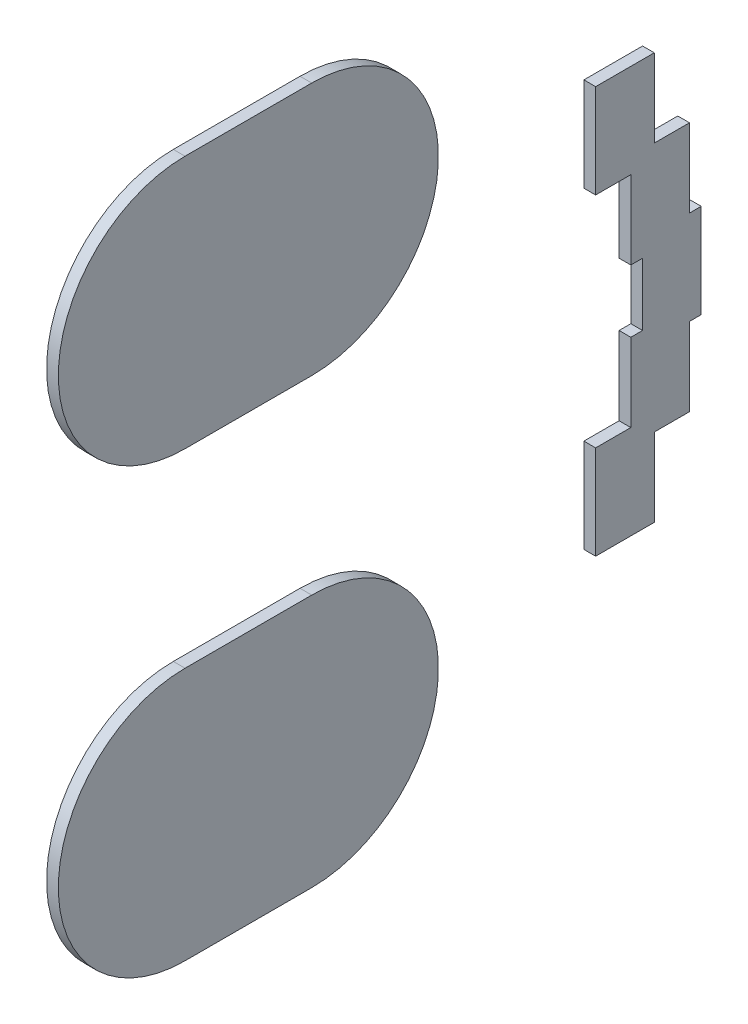
ISO-10303-21;
HEADER;
FILE_DESCRIPTION(('STEP AP214'),'2;1');
FILE_NAME('part.step','',(''),(''),'','','');
FILE_SCHEMA(('AUTOMOTIVE_DESIGN { 1 0 10303 214 1 1 1 1 }'));
ENDSEC;
DATA;
#1=APPLICATION_CONTEXT('core data for automotive mechanical design processes');
#2=APPLICATION_PROTOCOL_DEFINITION('international standard','automotive_design',2000,#1);
#3=PRODUCT_CONTEXT('',#1,'mechanical');
#4=PRODUCT('Part','Part','',(#3));
#5=PRODUCT_RELATED_PRODUCT_CATEGORY('part','',(#4));
#6=PRODUCT_DEFINITION_FORMATION('','',#4);
#7=PRODUCT_DEFINITION_CONTEXT('part definition',#1,'design');
#8=PRODUCT_DEFINITION('design','',#6,#7);
#9=PRODUCT_DEFINITION_SHAPE('','',#8);
#10=(LENGTH_UNIT() NAMED_UNIT(*) SI_UNIT(.MILLI.,.METRE.));
#11=(NAMED_UNIT(*) PLANE_ANGLE_UNIT() SI_UNIT($,.RADIAN.));
#12=(NAMED_UNIT(*) SI_UNIT($,.STERADIAN.) SOLID_ANGLE_UNIT());
#13=UNCERTAINTY_MEASURE_WITH_UNIT(LENGTH_MEASURE(1.E-05),#10,'distance_accuracy_value','');
#14=(GEOMETRIC_REPRESENTATION_CONTEXT(3) GLOBAL_UNCERTAINTY_ASSIGNED_CONTEXT((#13)) GLOBAL_UNIT_ASSIGNED_CONTEXT((#10,
#11,#12)) REPRESENTATION_CONTEXT('',''));
#15=CARTESIAN_POINT('',(0.,0.,0.));
#16=DIRECTION('',(0.,0.,1.));
#17=DIRECTION('',(1.,0.,0.));
#18=AXIS2_PLACEMENT_3D('',#15,#16,#17);
#19=CARTESIAN_POINT('',(29.8,3.2,22.65));
#20=DIRECTION('',(0.,-1.,0.));
#21=DIRECTION('',(0.,0.,-1.));
#22=AXIS2_PLACEMENT_3D('',#19,#20,#21);
#23=PLANE('',#22);
#24=DIRECTION('',(-1.,0.,0.));
#25=VECTOR('',#24,1.);
#26=CARTESIAN_POINT('',(29.8,3.2,22.05));
#27=LINE('',#26,#25);
#28=CARTESIAN_POINT('',(29.8,3.2,22.05));
#29=VERTEX_POINT('',#28);
#30=CARTESIAN_POINT('',(29.5,3.2,22.05));
#31=VERTEX_POINT('',#30);
#32=EDGE_CURVE('E12',#29,#31,#27,.T.);
#33=ORIENTED_EDGE('',*,*,#32,.F.);
#34=DIRECTION('',(0.,0.,-1.));
#35=VECTOR('',#34,1.);
#36=CARTESIAN_POINT('',(29.8,3.2,22.65));
#37=LINE('',#36,#35);
#38=CARTESIAN_POINT('',(29.8,3.2,21.15));
#39=VERTEX_POINT('',#38);
#40=EDGE_CURVE('E228',#29,#39,#37,.T.);
#41=ORIENTED_EDGE('',*,*,#40,.T.);
#42=DIRECTION('',(-1.,0.,0.));
#43=VECTOR('',#42,1.);
#44=CARTESIAN_POINT('',(29.8,3.2,21.15));
#45=LINE('',#44,#43);
#46=CARTESIAN_POINT('',(29.5,3.2,21.15));
#47=VERTEX_POINT('',#46);
#48=EDGE_CURVE('E220',#39,#47,#45,.T.);
#49=ORIENTED_EDGE('',*,*,#48,.T.);
#50=DIRECTION('',(0.,0.,-1.));
#51=VECTOR('',#50,1.);
#52=CARTESIAN_POINT('',(29.5,3.2,22.65));
#53=LINE('',#52,#51);
#54=EDGE_CURVE('E222',#31,#47,#53,.T.);
#55=ORIENTED_EDGE('',*,*,#54,.F.);
#56=EDGE_LOOP('',(#33,#41,#49,#55));
#57=FACE_BOUND('',#56,.T.);
#58=ADVANCED_FACE('F49',(#57),#23,.F.);
#59=CARTESIAN_POINT('',(0.,0.,22.65));
#60=DIRECTION('',(0.,0.,1.));
#61=DIRECTION('',(1.,0.,0.));
#62=AXIS2_PLACEMENT_3D('',#59,#60,#61);
#63=PLANE('',#62);
#64=DIRECTION('',(0.,1.,0.));
#65=VECTOR('',#64,1.);
#66=CARTESIAN_POINT('',(29.8,0.8,22.65));
#67=LINE('',#66,#65);
#68=CARTESIAN_POINT('',(29.8,0.8,22.65));
#69=VERTEX_POINT('',#68);
#70=CARTESIAN_POINT('',(29.8,2.8,22.65));
#71=VERTEX_POINT('',#70);
#72=EDGE_CURVE('E218',#69,#71,#67,.T.);
#73=ORIENTED_EDGE('',*,*,#72,.T.);
#74=DIRECTION('',(-1.,0.,0.));
#75=VECTOR('',#74,1.);
#76=CARTESIAN_POINT('',(0.,2.8,22.65));
#77=LINE('',#76,#75);
#78=CARTESIAN_POINT('',(29.5,2.8,22.65));
#79=VERTEX_POINT('',#78);
#80=EDGE_CURVE('E59',#71,#79,#77,.T.);
#81=ORIENTED_EDGE('',*,*,#80,.T.);
#82=DIRECTION('',(0.,-1.,0.));
#83=VECTOR('',#82,1.);
#84=CARTESIAN_POINT('',(29.5,3.2,22.65));
#85=LINE('',#84,#83);
#86=CARTESIAN_POINT('',(29.5,0.8,22.65));
#87=VERTEX_POINT('',#86);
#88=EDGE_CURVE('E202',#79,#87,#85,.T.);
#89=ORIENTED_EDGE('',*,*,#88,.T.);
#90=DIRECTION('',(1.,0.,0.));
#91=VECTOR('',#90,1.);
#92=CARTESIAN_POINT('',(29.5,0.8,22.65));
#93=LINE('',#92,#91);
#94=EDGE_CURVE('E216',#87,#69,#93,.T.);
#95=ORIENTED_EDGE('',*,*,#94,.T.);
#96=EDGE_LOOP('',(#73,#81,#89,#95));
#97=FACE_BOUND('',#96,.T.);
#98=ADVANCED_FACE('F330',(#97),#63,.T.);
#99=CARTESIAN_POINT('',(0.,0.,22.35));
#100=DIRECTION('',(0.,0.,1.));
#101=DIRECTION('',(1.,0.,0.));
#102=AXIS2_PLACEMENT_3D('',#99,#100,#101);
#103=PLANE('',#102);
#104=DIRECTION('',(0.,1.,0.));
#105=VECTOR('',#104,1.);
#106=CARTESIAN_POINT('',(29.8,-1.2,22.35));
#107=LINE('',#106,#105);
#108=CARTESIAN_POINT('',(29.8,-0.8,22.35));
#109=VERTEX_POINT('',#108);
#110=CARTESIAN_POINT('',(29.8,0.8,22.35));
#111=VERTEX_POINT('',#110);
#112=EDGE_CURVE('E239',#109,#111,#107,.T.);
#113=ORIENTED_EDGE('',*,*,#112,.T.);
#114=DIRECTION('',(-1.,0.,0.));
#115=VECTOR('',#114,1.);
#116=CARTESIAN_POINT('',(0.,0.8,22.35));
#117=LINE('',#116,#115);
#118=CARTESIAN_POINT('',(29.5,0.8,22.35));
#119=VERTEX_POINT('',#118);
#120=EDGE_CURVE('E71',#111,#119,#117,.T.);
#121=ORIENTED_EDGE('',*,*,#120,.T.);
#122=DIRECTION('',(0.,-1.,0.));
#123=VECTOR('',#122,1.);
#124=CARTESIAN_POINT('',(29.5,1.2,22.35));
#125=LINE('',#124,#123);
#126=CARTESIAN_POINT('',(29.5,-0.8,22.35));
#127=VERTEX_POINT('',#126);
#128=EDGE_CURVE('E240',#119,#127,#125,.T.);
#129=ORIENTED_EDGE('',*,*,#128,.T.);
#130=DIRECTION('',(-1.,0.,0.));
#131=VECTOR('',#130,1.);
#132=CARTESIAN_POINT('',(29.8,-0.8,22.35));
#133=LINE('',#132,#131);
#134=EDGE_CURVE('E319',#109,#127,#133,.T.);
#135=ORIENTED_EDGE('',*,*,#134,.F.);
#136=EDGE_LOOP('',(#113,#121,#129,#135));
#137=FACE_BOUND('',#136,.T.);
#138=ADVANCED_FACE('F415',(#137),#103,.T.);
#139=CARTESIAN_POINT('',(29.8,1.2,22.35));
#140=DIRECTION('',(0.,-1.,0.));
#141=DIRECTION('',(0.,0.,-1.));
#142=AXIS2_PLACEMENT_3D('',#139,#140,#141);
#143=PLANE('',#142);
#144=DIRECTION('',(-1.,0.,0.));
#145=VECTOR('',#144,1.);
#146=CARTESIAN_POINT('',(29.8,1.2,21.15));
#147=LINE('',#146,#145);
#148=CARTESIAN_POINT('',(29.8,1.2,21.15));
#149=VERTEX_POINT('',#148);
#150=CARTESIAN_POINT('',(29.5,1.2,21.15));
#151=VERTEX_POINT('',#150);
#152=EDGE_CURVE('E323',#149,#151,#147,.T.);
#153=ORIENTED_EDGE('',*,*,#152,.F.);
#154=DIRECTION('',(0.,0.,-1.));
#155=VECTOR('',#154,1.);
#156=CARTESIAN_POINT('',(29.8,1.2,22.35));
#157=LINE('',#156,#155);
#158=CARTESIAN_POINT('',(29.8,1.2,20.85));
#159=VERTEX_POINT('',#158);
#160=EDGE_CURVE('E255',#149,#159,#157,.T.);
#161=ORIENTED_EDGE('',*,*,#160,.T.);
#162=DIRECTION('',(-1.,0.,0.));
#163=VECTOR('',#162,1.);
#164=CARTESIAN_POINT('',(29.8,1.2,20.85));
#165=LINE('',#164,#163);
#166=CARTESIAN_POINT('',(29.5,1.2,20.85));
#167=VERTEX_POINT('',#166);
#168=EDGE_CURVE('E238',#159,#167,#165,.T.);
#169=ORIENTED_EDGE('',*,*,#168,.T.);
#170=DIRECTION('',(0.,0.,-1.));
#171=VECTOR('',#170,1.);
#172=CARTESIAN_POINT('',(29.5,1.2,22.35));
#173=LINE('',#172,#171);
#174=EDGE_CURVE('E245',#151,#167,#173,.T.);
#175=ORIENTED_EDGE('',*,*,#174,.F.);
#176=EDGE_LOOP('',(#153,#161,#169,#175));
#177=FACE_BOUND('',#176,.T.);
#178=ADVANCED_FACE('F361',(#177),#143,.F.);
#179=CARTESIAN_POINT('',(0.,0.,21.15));
#180=DIRECTION('',(0.,0.,1.));
#181=DIRECTION('',(1.,0.,0.));
#182=AXIS2_PLACEMENT_3D('',#179,#180,#181);
#183=PLANE('',#182);
#184=DIRECTION('',(-1.,0.,0.));
#185=VECTOR('',#184,1.);
#186=CARTESIAN_POINT('',(0.,-1.2,21.15));
#187=LINE('',#186,#185);
#188=CARTESIAN_POINT('',(29.8,-1.2,21.15));
#189=VERTEX_POINT('',#188);
#190=CARTESIAN_POINT('',(29.5,-1.2,21.15));
#191=VERTEX_POINT('',#190);
#192=EDGE_CURVE('E320',#189,#191,#187,.T.);
#193=ORIENTED_EDGE('',*,*,#192,.F.);
#194=DIRECTION('',(0.,1.,0.));
#195=VECTOR('',#194,1.);
#196=CARTESIAN_POINT('',(29.8,-3.2,21.15));
#197=LINE('',#196,#195);
#198=CARTESIAN_POINT('',(29.8,-3.2,21.15));
#199=VERTEX_POINT('',#198);
#200=EDGE_CURVE('E264',#199,#189,#197,.T.);
#201=ORIENTED_EDGE('',*,*,#200,.F.);
#202=DIRECTION('',(1.,0.,0.));
#203=VECTOR('',#202,1.);
#204=CARTESIAN_POINT('',(29.5,-3.2,21.15));
#205=LINE('',#204,#203);
#206=CARTESIAN_POINT('',(29.5,-3.2,21.15));
#207=VERTEX_POINT('',#206);
#208=EDGE_CURVE('E271',#207,#199,#205,.T.);
#209=ORIENTED_EDGE('',*,*,#208,.F.);
#210=DIRECTION('',(0.,-1.,0.));
#211=VECTOR('',#210,1.);
#212=CARTESIAN_POINT('',(29.5,-0.8,21.15));
#213=LINE('',#212,#211);
#214=EDGE_CURVE('E257',#191,#207,#213,.T.);
#215=ORIENTED_EDGE('',*,*,#214,.F.);
#216=EDGE_LOOP('',(#193,#201,#209,#215));
#217=FACE_BOUND('',#216,.T.);
#218=ADVANCED_FACE('F377',(#217),#183,.F.);
#219=CARTESIAN_POINT('',(0.,0.,22.05));
#220=DIRECTION('',(0.,0.,1.));
#221=DIRECTION('',(1.,0.,0.));
#222=AXIS2_PLACEMENT_3D('',#219,#220,#221);
#223=PLANE('',#222);
#224=DIRECTION('',(-1.,0.,0.));
#225=VECTOR('',#224,1.);
#226=CARTESIAN_POINT('',(0.,-3.2,22.05));
#227=LINE('',#226,#225);
#228=CARTESIAN_POINT('',(29.8,-3.2,22.05));
#229=VERTEX_POINT('',#228);
#230=CARTESIAN_POINT('',(29.5,-3.2,22.05));
#231=VERTEX_POINT('',#230);
#232=EDGE_CURVE('E315',#229,#231,#227,.T.);
#233=ORIENTED_EDGE('',*,*,#232,.F.);
#234=DIRECTION('',(0.,1.,0.));
#235=VECTOR('',#234,1.);
#236=CARTESIAN_POINT('',(29.8,-5.2,22.05));
#237=LINE('',#236,#235);
#238=CARTESIAN_POINT('',(29.8,-5.2,22.05));
#239=VERTEX_POINT('',#238);
#240=EDGE_CURVE('E287',#239,#229,#237,.T.);
#241=ORIENTED_EDGE('',*,*,#240,.F.);
#242=DIRECTION('',(1.,0.,0.));
#243=VECTOR('',#242,1.);
#244=CARTESIAN_POINT('',(29.5,-5.2,22.05));
#245=LINE('',#244,#243);
#246=CARTESIAN_POINT('',(29.5,-5.2,22.05));
#247=VERTEX_POINT('',#246);
#248=EDGE_CURVE('E298',#247,#239,#245,.T.);
#249=ORIENTED_EDGE('',*,*,#248,.F.);
#250=DIRECTION('',(0.,-1.,0.));
#251=VECTOR('',#250,1.);
#252=CARTESIAN_POINT('',(29.5,-2.8,22.05));
#253=LINE('',#252,#251);
#254=EDGE_CURVE('E281',#231,#247,#253,.T.);
#255=ORIENTED_EDGE('',*,*,#254,.F.);
#256=EDGE_LOOP('',(#233,#241,#249,#255));
#257=FACE_BOUND('',#256,.T.);
#258=ADVANCED_FACE('F384',(#257),#223,.F.);
#259=CARTESIAN_POINT('',(29.5,-2.8,23.55));
#260=DIRECTION('',(1.,0.,0.));
#261=DIRECTION('',(0.,0.,-1.));
#262=AXIS2_PLACEMENT_3D('',#259,#260,#261);
#263=PLANE('',#262);
#264=ORIENTED_EDGE('',*,*,#88,.F.);
#265=DIRECTION('',(0.,0.,-1.));
#266=VECTOR('',#265,1.);
#267=CARTESIAN_POINT('',(29.5,2.8,23.55));
#268=LINE('',#267,#266);
#269=CARTESIAN_POINT('',(29.5,2.8,23.55));
#270=VERTEX_POINT('',#269);
#271=EDGE_CURVE('E61',#270,#79,#268,.T.);
#272=ORIENTED_EDGE('',*,*,#271,.F.);
#273=DIRECTION('',(0.,-1.,0.));
#274=VECTOR('',#273,1.);
#275=CARTESIAN_POINT('',(29.5,5.2,23.55));
#276=LINE('',#275,#274);
#277=CARTESIAN_POINT('',(29.5,5.2,23.55));
#278=VERTEX_POINT('',#277);
#279=EDGE_CURVE('E195',#278,#270,#276,.T.);
#280=ORIENTED_EDGE('',*,*,#279,.F.);
#281=DIRECTION('',(0.,0.,-1.));
#282=VECTOR('',#281,1.);
#283=CARTESIAN_POINT('',(29.5,5.2,23.55));
#284=LINE('',#283,#282);
#285=CARTESIAN_POINT('',(29.5,5.2,22.05));
#286=VERTEX_POINT('',#285);
#287=EDGE_CURVE('E337',#278,#286,#284,.T.);
#288=ORIENTED_EDGE('',*,*,#287,.T.);
#289=DIRECTION('',(0.,-1.,0.));
#290=VECTOR('',#289,1.);
#291=CARTESIAN_POINT('',(29.5,5.2,22.05));
#292=LINE('',#291,#290);
#293=EDGE_CURVE('E339',#286,#31,#292,.T.);
#294=ORIENTED_EDGE('',*,*,#293,.T.);
#295=ORIENTED_EDGE('',*,*,#54,.T.);
#296=DIRECTION('',(0.,-1.,0.));
#297=VECTOR('',#296,1.);
#298=CARTESIAN_POINT('',(29.5,3.2,21.15));
#299=LINE('',#298,#297);
#300=EDGE_CURVE('E206',#47,#151,#299,.T.);
#301=ORIENTED_EDGE('',*,*,#300,.T.);
#302=ORIENTED_EDGE('',*,*,#174,.T.);
#303=DIRECTION('',(0.,-1.,0.));
#304=VECTOR('',#303,1.);
#305=CARTESIAN_POINT('',(29.5,1.2,20.85));
#306=LINE('',#305,#304);
#307=CARTESIAN_POINT('',(29.5,-1.2,20.85));
#308=VERTEX_POINT('',#307);
#309=EDGE_CURVE('E237',#167,#308,#306,.T.);
#310=ORIENTED_EDGE('',*,*,#309,.T.);
#311=DIRECTION('',(0.,0.,-1.));
#312=VECTOR('',#311,1.);
#313=CARTESIAN_POINT('',(29.5,-1.2,22.35));
#314=LINE('',#313,#312);
#315=EDGE_CURVE('E256',#191,#308,#314,.T.);
#316=ORIENTED_EDGE('',*,*,#315,.F.);
#317=ORIENTED_EDGE('',*,*,#214,.T.);
#318=DIRECTION('',(0.,0.,-1.));
#319=VECTOR('',#318,1.);
#320=CARTESIAN_POINT('',(29.5,-3.2,22.65));
#321=LINE('',#320,#319);
#322=EDGE_CURVE('E285',#231,#207,#321,.T.);
#323=ORIENTED_EDGE('',*,*,#322,.F.);
#324=ORIENTED_EDGE('',*,*,#254,.T.);
#325=DIRECTION('',(0.,0.,-1.));
#326=VECTOR('',#325,1.);
#327=CARTESIAN_POINT('',(29.5,-5.2,23.55));
#328=LINE('',#327,#326);
#329=CARTESIAN_POINT('',(29.5,-5.2,23.55));
#330=VERTEX_POINT('',#329);
#331=EDGE_CURVE('E310',#330,#247,#328,.T.);
#332=ORIENTED_EDGE('',*,*,#331,.F.);
#333=DIRECTION('',(0.,-1.,0.));
#334=VECTOR('',#333,1.);
#335=CARTESIAN_POINT('',(29.5,-2.8,23.55));
#336=LINE('',#335,#334);
#337=CARTESIAN_POINT('',(29.5,-2.8,23.55));
#338=VERTEX_POINT('',#337);
#339=EDGE_CURVE('E288',#338,#330,#336,.T.);
#340=ORIENTED_EDGE('',*,*,#339,.F.);
#341=DIRECTION('',(0.,0.,-1.));
#342=VECTOR('',#341,1.);
#343=CARTESIAN_POINT('',(29.5,-2.8,23.55));
#344=LINE('',#343,#342);
#345=CARTESIAN_POINT('',(29.5,-2.8,22.65));
#346=VERTEX_POINT('',#345);
#347=EDGE_CURVE('E297',#338,#346,#344,.T.);
#348=ORIENTED_EDGE('',*,*,#347,.T.);
#349=DIRECTION('',(0.,-1.,0.));
#350=VECTOR('',#349,1.);
#351=CARTESIAN_POINT('',(29.5,-0.8,22.65));
#352=LINE('',#351,#350);
#353=CARTESIAN_POINT('',(29.5,-0.8,22.65));
#354=VERTEX_POINT('',#353);
#355=EDGE_CURVE('E261',#354,#346,#352,.T.);
#356=ORIENTED_EDGE('',*,*,#355,.F.);
#357=DIRECTION('',(0.,0.,-1.));
#358=VECTOR('',#357,1.);
#359=CARTESIAN_POINT('',(29.5,-0.8,22.65));
#360=LINE('',#359,#358);
#361=EDGE_CURVE('E267',#354,#127,#360,.T.);
#362=ORIENTED_EDGE('',*,*,#361,.T.);
#363=ORIENTED_EDGE('',*,*,#128,.F.);
#364=DIRECTION('',(0.,0.,-1.));
#365=VECTOR('',#364,1.);
#366=CARTESIAN_POINT('',(29.5,0.8,22.65));
#367=LINE('',#366,#365);
#368=EDGE_CURVE('E231',#87,#119,#367,.T.);
#369=ORIENTED_EDGE('',*,*,#368,.F.);
#370=EDGE_LOOP('',(#264,#272,#280,#288,#294,#295,#301,#302,#310,#316,#317,#323,#324,#332,#340,
#348,#356,#362,#363,#369));
#371=FACE_BOUND('',#370,.T.);
#372=ADVANCED_FACE('F55',(#371),#263,.F.);
#373=CARTESIAN_POINT('',(29.5,-5.2,23.55));
#374=DIRECTION('',(0.,1.,0.));
#375=DIRECTION('',(0.,0.,1.));
#376=AXIS2_PLACEMENT_3D('',#373,#374,#375);
#377=PLANE('',#376);
#378=ORIENTED_EDGE('',*,*,#248,.T.);
#379=DIRECTION('',(0.,0.,-1.));
#380=VECTOR('',#379,1.);
#381=CARTESIAN_POINT('',(29.8,-5.2,23.55));
#382=LINE('',#381,#380);
#383=CARTESIAN_POINT('',(29.8,-5.2,23.55));
#384=VERTEX_POINT('',#383);
#385=EDGE_CURVE('E308',#384,#239,#382,.T.);
#386=ORIENTED_EDGE('',*,*,#385,.F.);
#387=DIRECTION('',(1.,0.,0.));
#388=VECTOR('',#387,1.);
#389=CARTESIAN_POINT('',(29.5,-5.2,23.55));
#390=LINE('',#389,#388);
#391=EDGE_CURVE('E289',#330,#384,#390,.T.);
#392=ORIENTED_EDGE('',*,*,#391,.F.);
#393=ORIENTED_EDGE('',*,*,#331,.T.);
#394=EDGE_LOOP('',(#378,#386,#392,#393));
#395=FACE_BOUND('',#394,.T.);
#396=ADVANCED_FACE('F386',(#395),#377,.F.);
#397=CARTESIAN_POINT('',(29.8,-5.2,23.55));
#398=DIRECTION('',(-1.,0.,0.));
#399=DIRECTION('',(0.,0.,1.));
#400=AXIS2_PLACEMENT_3D('',#397,#398,#399);
#401=PLANE('',#400);
#402=ORIENTED_EDGE('',*,*,#40,.F.);
#403=DIRECTION('',(0.,1.,0.));
#404=VECTOR('',#403,1.);
#405=CARTESIAN_POINT('',(29.8,2.8,22.05));
#406=LINE('',#405,#404);
#407=CARTESIAN_POINT('',(29.8,5.2,22.05));
#408=VERTEX_POINT('',#407);
#409=EDGE_CURVE('E345',#29,#408,#406,.T.);
#410=ORIENTED_EDGE('',*,*,#409,.T.);
#411=DIRECTION('',(0.,0.,-1.));
#412=VECTOR('',#411,1.);
#413=CARTESIAN_POINT('',(29.8,5.2,23.55));
#414=LINE('',#413,#412);
#415=CARTESIAN_POINT('',(29.8,5.2,23.55));
#416=VERTEX_POINT('',#415);
#417=EDGE_CURVE('E211',#416,#408,#414,.T.);
#418=ORIENTED_EDGE('',*,*,#417,.F.);
#419=DIRECTION('',(0.,1.,0.));
#420=VECTOR('',#419,1.);
#421=CARTESIAN_POINT('',(29.8,2.8,23.55));
#422=LINE('',#421,#420);
#423=CARTESIAN_POINT('',(29.8,2.8,23.55));
#424=VERTEX_POINT('',#423);
#425=EDGE_CURVE('E193',#424,#416,#422,.T.);
#426=ORIENTED_EDGE('',*,*,#425,.F.);
#427=DIRECTION('',(0.,0.,-1.));
#428=VECTOR('',#427,1.);
#429=CARTESIAN_POINT('',(29.8,2.8,23.55));
#430=LINE('',#429,#428);
#431=EDGE_CURVE('E188',#424,#71,#430,.T.);
#432=ORIENTED_EDGE('',*,*,#431,.T.);
#433=ORIENTED_EDGE('',*,*,#72,.F.);
#434=DIRECTION('',(0.,0.,-1.));
#435=VECTOR('',#434,1.);
#436=CARTESIAN_POINT('',(29.8,0.8,22.65));
#437=LINE('',#436,#435);
#438=EDGE_CURVE('E226',#69,#111,#437,.T.);
#439=ORIENTED_EDGE('',*,*,#438,.T.);
#440=ORIENTED_EDGE('',*,*,#112,.F.);
#441=DIRECTION('',(0.,0.,-1.));
#442=VECTOR('',#441,1.);
#443=CARTESIAN_POINT('',(29.8,-0.8,22.65));
#444=LINE('',#443,#442);
#445=CARTESIAN_POINT('',(29.8,-0.8,22.65));
#446=VERTEX_POINT('',#445);
#447=EDGE_CURVE('E279',#446,#109,#444,.T.);
#448=ORIENTED_EDGE('',*,*,#447,.F.);
#449=DIRECTION('',(0.,1.,0.));
#450=VECTOR('',#449,1.);
#451=CARTESIAN_POINT('',(29.8,-3.2,22.65));
#452=LINE('',#451,#450);
#453=CARTESIAN_POINT('',(29.8,-2.8,22.65));
#454=VERTEX_POINT('',#453);
#455=EDGE_CURVE('E262',#454,#446,#452,.T.);
#456=ORIENTED_EDGE('',*,*,#455,.F.);
#457=DIRECTION('',(0.,0.,-1.));
#458=VECTOR('',#457,1.);
#459=CARTESIAN_POINT('',(29.8,-2.8,23.55));
#460=LINE('',#459,#458);
#461=CARTESIAN_POINT('',(29.8,-2.8,23.55));
#462=VERTEX_POINT('',#461);
#463=EDGE_CURVE('E304',#462,#454,#460,.T.);
#464=ORIENTED_EDGE('',*,*,#463,.F.);
#465=DIRECTION('',(0.,1.,0.));
#466=VECTOR('',#465,1.);
#467=CARTESIAN_POINT('',(29.8,-5.2,23.55));
#468=LINE('',#467,#466);
#469=EDGE_CURVE('E295',#384,#462,#468,.T.);
#470=ORIENTED_EDGE('',*,*,#469,.F.);
#471=ORIENTED_EDGE('',*,*,#385,.T.);
#472=ORIENTED_EDGE('',*,*,#240,.T.);
#473=DIRECTION('',(0.,0.,-1.));
#474=VECTOR('',#473,1.);
#475=CARTESIAN_POINT('',(29.8,-3.2,22.65));
#476=LINE('',#475,#474);
#477=EDGE_CURVE('E278',#229,#199,#476,.T.);
#478=ORIENTED_EDGE('',*,*,#477,.T.);
#479=ORIENTED_EDGE('',*,*,#200,.T.);
#480=DIRECTION('',(0.,0.,-1.));
#481=VECTOR('',#480,1.);
#482=CARTESIAN_POINT('',(29.8,-1.2,22.35));
#483=LINE('',#482,#481);
#484=CARTESIAN_POINT('',(29.8,-1.2,20.85));
#485=VERTEX_POINT('',#484);
#486=EDGE_CURVE('E258',#189,#485,#483,.T.);
#487=ORIENTED_EDGE('',*,*,#486,.T.);
#488=DIRECTION('',(0.,1.,0.));
#489=VECTOR('',#488,1.);
#490=CARTESIAN_POINT('',(29.8,-1.2,20.85));
#491=LINE('',#490,#489);
#492=EDGE_CURVE('E246',#485,#159,#491,.T.);
#493=ORIENTED_EDGE('',*,*,#492,.T.);
#494=ORIENTED_EDGE('',*,*,#160,.F.);
#495=DIRECTION('',(0.,1.,0.));
#496=VECTOR('',#495,1.);
#497=CARTESIAN_POINT('',(29.8,0.8,21.15));
#498=LINE('',#497,#496);
#499=EDGE_CURVE('E207',#149,#39,#498,.T.);
#500=ORIENTED_EDGE('',*,*,#499,.T.);
#501=EDGE_LOOP('',(#402,#410,#418,#426,#432,#433,#439,#440,#448,#456,#464,#470,#471,#472,#478,
#479,#487,#493,#494,#500));
#502=FACE_BOUND('',#501,.T.);
#503=ADVANCED_FACE('F335',(#502),#401,.F.);
#504=CARTESIAN_POINT('',(29.8,-2.8,23.55));
#505=DIRECTION('',(0.,-1.,0.));
#506=DIRECTION('',(0.,0.,-1.));
#507=AXIS2_PLACEMENT_3D('',#504,#505,#506);
#508=PLANE('',#507);
#509=ORIENTED_EDGE('',*,*,#463,.T.);
#510=DIRECTION('',(-1.,0.,0.));
#511=VECTOR('',#510,1.);
#512=CARTESIAN_POINT('',(29.8,-2.8,22.65));
#513=LINE('',#512,#511);
#514=EDGE_CURVE('E312',#454,#346,#513,.T.);
#515=ORIENTED_EDGE('',*,*,#514,.T.);
#516=ORIENTED_EDGE('',*,*,#347,.F.);
#517=DIRECTION('',(-1.,0.,0.));
#518=VECTOR('',#517,1.);
#519=CARTESIAN_POINT('',(29.8,-2.8,23.55));
#520=LINE('',#519,#518);
#521=EDGE_CURVE('E294',#462,#338,#520,.T.);
#522=ORIENTED_EDGE('',*,*,#521,.F.);
#523=EDGE_LOOP('',(#509,#515,#516,#522));
#524=FACE_BOUND('',#523,.T.);
#525=ADVANCED_FACE('F398',(#524),#508,.F.);
#526=CARTESIAN_POINT('',(0.,0.,23.55));
#527=DIRECTION('',(0.,0.,1.));
#528=DIRECTION('',(1.,0.,0.));
#529=AXIS2_PLACEMENT_3D('',#526,#527,#528);
#530=PLANE('',#529);
#531=ORIENTED_EDGE('',*,*,#339,.T.);
#532=ORIENTED_EDGE('',*,*,#391,.T.);
#533=ORIENTED_EDGE('',*,*,#469,.T.);
#534=ORIENTED_EDGE('',*,*,#521,.T.);
#535=EDGE_LOOP('',(#531,#532,#533,#534));
#536=FACE_BOUND('',#535,.T.);
#537=ADVANCED_FACE('F392',(#536),#530,.T.);
#538=CARTESIAN_POINT('',(0.,0.,22.65));
#539=DIRECTION('',(0.,0.,1.));
#540=DIRECTION('',(1.,0.,0.));
#541=AXIS2_PLACEMENT_3D('',#538,#539,#540);
#542=PLANE('',#541);
#543=ORIENTED_EDGE('',*,*,#514,.F.);
#544=ORIENTED_EDGE('',*,*,#455,.T.);
#545=DIRECTION('',(-1.,0.,0.));
#546=VECTOR('',#545,1.);
#547=CARTESIAN_POINT('',(29.8,-0.8,22.65));
#548=LINE('',#547,#546);
#549=EDGE_CURVE('E270',#446,#354,#548,.T.);
#550=ORIENTED_EDGE('',*,*,#549,.T.);
#551=ORIENTED_EDGE('',*,*,#355,.T.);
#552=EDGE_LOOP('',(#543,#544,#550,#551));
#553=FACE_BOUND('',#552,.T.);
#554=ADVANCED_FACE('F397',(#553),#542,.T.);
#555=CARTESIAN_POINT('',(29.5,-3.2,22.65));
#556=DIRECTION('',(0.,1.,0.));
#557=DIRECTION('',(0.,0.,1.));
#558=AXIS2_PLACEMENT_3D('',#555,#556,#557);
#559=PLANE('',#558);
#560=ORIENTED_EDGE('',*,*,#477,.F.);
#561=ORIENTED_EDGE('',*,*,#232,.T.);
#562=ORIENTED_EDGE('',*,*,#322,.T.);
#563=ORIENTED_EDGE('',*,*,#208,.T.);
#564=EDGE_LOOP('',(#560,#561,#562,#563));
#565=FACE_BOUND('',#564,.T.);
#566=ADVANCED_FACE('F380',(#565),#559,.F.);
#567=CARTESIAN_POINT('',(29.8,-0.8,22.65));
#568=DIRECTION('',(0.,-1.,0.));
#569=DIRECTION('',(0.,0.,-1.));
#570=AXIS2_PLACEMENT_3D('',#567,#568,#569);
#571=PLANE('',#570);
#572=ORIENTED_EDGE('',*,*,#447,.T.);
#573=ORIENTED_EDGE('',*,*,#134,.T.);
#574=ORIENTED_EDGE('',*,*,#361,.F.);
#575=ORIENTED_EDGE('',*,*,#549,.F.);
#576=EDGE_LOOP('',(#572,#573,#574,#575));
#577=FACE_BOUND('',#576,.T.);
#578=ADVANCED_FACE('F407',(#577),#571,.F.);
#579=CARTESIAN_POINT('',(29.5,-1.2,22.35));
#580=DIRECTION('',(0.,1.,0.));
#581=DIRECTION('',(0.,0.,1.));
#582=AXIS2_PLACEMENT_3D('',#579,#580,#581);
#583=PLANE('',#582);
#584=ORIENTED_EDGE('',*,*,#486,.F.);
#585=ORIENTED_EDGE('',*,*,#192,.T.);
#586=ORIENTED_EDGE('',*,*,#315,.T.);
#587=DIRECTION('',(1.,0.,0.));
#588=VECTOR('',#587,1.);
#589=CARTESIAN_POINT('',(29.5,-1.2,20.85));
#590=LINE('',#589,#588);
#591=EDGE_CURVE('E241',#308,#485,#590,.T.);
#592=ORIENTED_EDGE('',*,*,#591,.T.);
#593=EDGE_LOOP('',(#584,#585,#586,#592));
#594=FACE_BOUND('',#593,.T.);
#595=ADVANCED_FACE('F371',(#594),#583,.F.);
#596=CARTESIAN_POINT('',(0.,0.,20.85));
#597=DIRECTION('',(0.,0.,1.));
#598=DIRECTION('',(1.,0.,0.));
#599=AXIS2_PLACEMENT_3D('',#596,#597,#598);
#600=PLANE('',#599);
#601=ORIENTED_EDGE('',*,*,#309,.F.);
#602=ORIENTED_EDGE('',*,*,#168,.F.);
#603=ORIENTED_EDGE('',*,*,#492,.F.);
#604=ORIENTED_EDGE('',*,*,#591,.F.);
#605=EDGE_LOOP('',(#601,#602,#603,#604));
#606=FACE_BOUND('',#605,.T.);
#607=ADVANCED_FACE('F366',(#606),#600,.F.);
#608=CARTESIAN_POINT('',(0.,0.,21.15));
#609=DIRECTION('',(0.,0.,1.));
#610=DIRECTION('',(1.,0.,0.));
#611=AXIS2_PLACEMENT_3D('',#608,#609,#610);
#612=PLANE('',#611);
#613=ORIENTED_EDGE('',*,*,#499,.F.);
#614=ORIENTED_EDGE('',*,*,#152,.T.);
#615=ORIENTED_EDGE('',*,*,#300,.F.);
#616=ORIENTED_EDGE('',*,*,#48,.F.);
#617=EDGE_LOOP('',(#613,#614,#615,#616));
#618=FACE_BOUND('',#617,.T.);
#619=ADVANCED_FACE('F356',(#618),#612,.F.);
#620=CARTESIAN_POINT('',(29.5,0.8,22.65));
#621=DIRECTION('',(0.,1.,0.));
#622=DIRECTION('',(0.,0.,1.));
#623=AXIS2_PLACEMENT_3D('',#620,#621,#622);
#624=PLANE('',#623);
#625=ORIENTED_EDGE('',*,*,#120,.F.);
#626=ORIENTED_EDGE('',*,*,#438,.F.);
#627=ORIENTED_EDGE('',*,*,#94,.F.);
#628=ORIENTED_EDGE('',*,*,#368,.T.);
#629=EDGE_LOOP('',(#625,#626,#627,#628));
#630=FACE_BOUND('',#629,.T.);
#631=ADVANCED_FACE('F409',(#630),#624,.F.);
#632=CARTESIAN_POINT('',(0.,0.,22.05));
#633=DIRECTION('',(0.,0.,1.));
#634=DIRECTION('',(1.,0.,0.));
#635=AXIS2_PLACEMENT_3D('',#632,#633,#634);
#636=PLANE('',#635);
#637=ORIENTED_EDGE('',*,*,#409,.F.);
#638=ORIENTED_EDGE('',*,*,#32,.T.);
#639=ORIENTED_EDGE('',*,*,#293,.F.);
#640=DIRECTION('',(-1.,0.,0.));
#641=VECTOR('',#640,1.);
#642=CARTESIAN_POINT('',(29.8,5.2,22.05));
#643=LINE('',#642,#641);
#644=EDGE_CURVE('E203',#408,#286,#643,.T.);
#645=ORIENTED_EDGE('',*,*,#644,.F.);
#646=EDGE_LOOP('',(#637,#638,#639,#645));
#647=FACE_BOUND('',#646,.T.);
#648=ADVANCED_FACE('F348',(#647),#636,.F.);
#649=CARTESIAN_POINT('',(29.5,2.8,23.55));
#650=DIRECTION('',(0.,1.,0.));
#651=DIRECTION('',(0.,0.,1.));
#652=AXIS2_PLACEMENT_3D('',#649,#650,#651);
#653=PLANE('',#652);
#654=ORIENTED_EDGE('',*,*,#80,.F.);
#655=ORIENTED_EDGE('',*,*,#431,.F.);
#656=DIRECTION('',(1.,0.,0.));
#657=VECTOR('',#656,1.);
#658=CARTESIAN_POINT('',(29.5,2.8,23.55));
#659=LINE('',#658,#657);
#660=EDGE_CURVE('E184',#270,#424,#659,.T.);
#661=ORIENTED_EDGE('',*,*,#660,.F.);
#662=ORIENTED_EDGE('',*,*,#271,.T.);
#663=EDGE_LOOP('',(#654,#655,#661,#662));
#664=FACE_BOUND('',#663,.T.);
#665=ADVANCED_FACE('F187',(#664),#653,.F.);
#666=CARTESIAN_POINT('',(29.8,5.2,23.55));
#667=DIRECTION('',(0.,-1.,0.));
#668=DIRECTION('',(0.,0.,-1.));
#669=AXIS2_PLACEMENT_3D('',#666,#667,#668);
#670=PLANE('',#669);
#671=ORIENTED_EDGE('',*,*,#644,.T.);
#672=ORIENTED_EDGE('',*,*,#287,.F.);
#673=DIRECTION('',(-1.,0.,0.));
#674=VECTOR('',#673,1.);
#675=CARTESIAN_POINT('',(29.8,5.2,23.55));
#676=LINE('',#675,#674);
#677=EDGE_CURVE('E197',#416,#278,#676,.T.);
#678=ORIENTED_EDGE('',*,*,#677,.F.);
#679=ORIENTED_EDGE('',*,*,#417,.T.);
#680=EDGE_LOOP('',(#671,#672,#678,#679));
#681=FACE_BOUND('',#680,.T.);
#682=ADVANCED_FACE('F350',(#681),#670,.F.);
#683=CARTESIAN_POINT('',(0.,0.,23.55));
#684=DIRECTION('',(0.,0.,1.));
#685=DIRECTION('',(1.,0.,0.));
#686=AXIS2_PLACEMENT_3D('',#683,#684,#685);
#687=PLANE('',#686);
#688=ORIENTED_EDGE('',*,*,#279,.T.);
#689=ORIENTED_EDGE('',*,*,#660,.T.);
#690=ORIENTED_EDGE('',*,*,#425,.T.);
#691=ORIENTED_EDGE('',*,*,#677,.T.);
#692=EDGE_LOOP('',(#688,#689,#690,#691));
#693=FACE_BOUND('',#692,.T.);
#694=ADVANCED_FACE('F192',(#693),#687,.T.);
#695=CLOSED_SHELL('',(#58,#98,#138,#178,#218,#258,#372,#396,#503,#525,#537,#554,#566,#578,#595,
#607,#619,#631,#648,#665,#682,#694));
#696=MANIFOLD_SOLID_BREP('B2',#695);
#697=CARTESIAN_POINT('',(29.5,-2.43,34.05));
#698=DIRECTION('',(1.,0.,0.));
#699=DIRECTION('',(0.,0.,-1.));
#700=AXIS2_PLACEMENT_3D('',#697,#698,#699);
#701=PLANE('',#700);
#702=DIRECTION('',(0.,0.,-1.));
#703=VECTOR('',#702,1.);
#704=CARTESIAN_POINT('',(29.5,-8.91,34.05));
#705=LINE('',#704,#703);
#706=CARTESIAN_POINT('',(29.5,-8.91,34.05));
#707=VERTEX_POINT('',#706);
#708=CARTESIAN_POINT('',(29.5,-8.91,30.81));
#709=VERTEX_POINT('',#708);
#710=EDGE_CURVE('E48',#707,#709,#705,.T.);
#711=ORIENTED_EDGE('',*,*,#710,.F.);
#712=CARTESIAN_POINT('',(29.5,-5.67,34.05));
#713=DIRECTION('',(1.,0.,0.));
#714=DIRECTION('',(0.,0.,-1.));
#715=AXIS2_PLACEMENT_3D('',#712,#713,#714);
#716=CIRCLE('',#715,3.24);
#717=CARTESIAN_POINT('',(29.5,-2.43,34.05));
#718=VERTEX_POINT('',#717);
#719=EDGE_CURVE('E672',#718,#707,#716,.T.);
#720=ORIENTED_EDGE('',*,*,#719,.F.);
#721=DIRECTION('',(0.,0.,-1.));
#722=VECTOR('',#721,1.);
#723=CARTESIAN_POINT('',(29.5,-2.43,34.05));
#724=LINE('',#723,#722);
#725=CARTESIAN_POINT('',(29.5,-2.43,30.81));
#726=VERTEX_POINT('',#725);
#727=EDGE_CURVE('E636',#718,#726,#724,.T.);
#728=ORIENTED_EDGE('',*,*,#727,.T.);
#729=CARTESIAN_POINT('',(29.5,-5.67,30.81));
#730=DIRECTION('',(1.,0.,0.));
#731=DIRECTION('',(0.,0.,-1.));
#732=AXIS2_PLACEMENT_3D('',#729,#730,#731);
#733=CIRCLE('',#732,3.24);
#734=EDGE_CURVE('E682',#709,#726,#733,.T.);
#735=ORIENTED_EDGE('',*,*,#734,.F.);
#736=EDGE_LOOP('',(#711,#720,#728,#735));
#737=FACE_BOUND('',#736,.T.);
#738=ADVANCED_FACE('F621',(#737),#701,.F.);
#739=CARTESIAN_POINT('',(29.5,-8.91,34.05));
#740=DIRECTION('',(0.,1.,0.));
#741=DIRECTION('',(0.,0.,1.));
#742=AXIS2_PLACEMENT_3D('',#739,#740,#741);
#743=PLANE('',#742);
#744=DIRECTION('',(1.,0.,0.));
#745=VECTOR('',#744,1.);
#746=CARTESIAN_POINT('',(29.5,-8.91,30.81));
#747=LINE('',#746,#745);
#748=CARTESIAN_POINT('',(29.8,-8.91,30.81));
#749=VERTEX_POINT('',#748);
#750=EDGE_CURVE('E661',#709,#749,#747,.T.);
#751=ORIENTED_EDGE('',*,*,#750,.T.);
#752=DIRECTION('',(0.,0.,-1.));
#753=VECTOR('',#752,1.);
#754=CARTESIAN_POINT('',(29.8,-8.91,34.05));
#755=LINE('',#754,#753);
#756=CARTESIAN_POINT('',(29.8,-8.91,34.05));
#757=VERTEX_POINT('',#756);
#758=EDGE_CURVE('E633',#757,#749,#755,.T.);
#759=ORIENTED_EDGE('',*,*,#758,.F.);
#760=DIRECTION('',(1.,0.,0.));
#761=VECTOR('',#760,1.);
#762=CARTESIAN_POINT('',(29.5,-8.91,34.05));
#763=LINE('',#762,#761);
#764=EDGE_CURVE('E665',#707,#757,#763,.T.);
#765=ORIENTED_EDGE('',*,*,#764,.F.);
#766=ORIENTED_EDGE('',*,*,#710,.T.);
#767=EDGE_LOOP('',(#751,#759,#765,#766));
#768=FACE_BOUND('',#767,.T.);
#769=ADVANCED_FACE('F662',(#768),#743,.F.);
#770=CARTESIAN_POINT('',(29.8,-8.91,34.05));
#771=DIRECTION('',(-1.,0.,0.));
#772=DIRECTION('',(0.,0.,1.));
#773=AXIS2_PLACEMENT_3D('',#770,#771,#772);
#774=PLANE('',#773);
#775=DIRECTION('',(0.,0.,-1.));
#776=VECTOR('',#775,1.);
#777=CARTESIAN_POINT('',(29.8,-2.43,34.05));
#778=LINE('',#777,#776);
#779=CARTESIAN_POINT('',(29.8,-2.43,34.05));
#780=VERTEX_POINT('',#779);
#781=CARTESIAN_POINT('',(29.8,-2.43,30.81));
#782=VERTEX_POINT('',#781);
#783=EDGE_CURVE('E668',#780,#782,#778,.T.);
#784=ORIENTED_EDGE('',*,*,#783,.F.);
#785=CARTESIAN_POINT('',(29.8,-5.67,34.05));
#786=DIRECTION('',(1.,0.,0.));
#787=DIRECTION('',(0.,0.,-1.));
#788=AXIS2_PLACEMENT_3D('',#785,#786,#787);
#789=CIRCLE('',#788,3.24);
#790=EDGE_CURVE('E671',#780,#757,#789,.T.);
#791=ORIENTED_EDGE('',*,*,#790,.T.);
#792=ORIENTED_EDGE('',*,*,#758,.T.);
#793=CARTESIAN_POINT('',(29.8,-5.67,30.81));
#794=DIRECTION('',(1.,0.,0.));
#795=DIRECTION('',(0.,0.,-1.));
#796=AXIS2_PLACEMENT_3D('',#793,#794,#795);
#797=CIRCLE('',#796,3.24);
#798=EDGE_CURVE('E683',#749,#782,#797,.T.);
#799=ORIENTED_EDGE('',*,*,#798,.T.);
#800=EDGE_LOOP('',(#784,#791,#792,#799));
#801=FACE_BOUND('',#800,.T.);
#802=ADVANCED_FACE('F679',(#801),#774,.F.);
#803=CARTESIAN_POINT('',(29.8,-2.43,34.05));
#804=DIRECTION('',(0.,-1.,0.));
#805=DIRECTION('',(0.,0.,-1.));
#806=AXIS2_PLACEMENT_3D('',#803,#804,#805);
#807=PLANE('',#806);
#808=DIRECTION('',(-1.,0.,0.));
#809=VECTOR('',#808,1.);
#810=CARTESIAN_POINT('',(29.8,-2.43,30.81));
#811=LINE('',#810,#809);
#812=EDGE_CURVE('E680',#782,#726,#811,.T.);
#813=ORIENTED_EDGE('',*,*,#812,.T.);
#814=ORIENTED_EDGE('',*,*,#727,.F.);
#815=DIRECTION('',(-1.,0.,0.));
#816=VECTOR('',#815,1.);
#817=CARTESIAN_POINT('',(29.8,-2.43,34.05));
#818=LINE('',#817,#816);
#819=EDGE_CURVE('E677',#780,#718,#818,.T.);
#820=ORIENTED_EDGE('',*,*,#819,.F.);
#821=ORIENTED_EDGE('',*,*,#783,.T.);
#822=EDGE_LOOP('',(#813,#814,#820,#821));
#823=FACE_BOUND('',#822,.T.);
#824=ADVANCED_FACE('F692',(#823),#807,.F.);
#825=CARTESIAN_POINT('',(29.8,-5.67,30.81));
#826=DIRECTION('',(-1.,0.,0.));
#827=DIRECTION('',(0.,0.,1.));
#828=AXIS2_PLACEMENT_3D('',#825,#826,#827);
#829=CYLINDRICAL_SURFACE('',#828,3.24);
#830=ORIENTED_EDGE('',*,*,#734,.T.);
#831=ORIENTED_EDGE('',*,*,#812,.F.);
#832=ORIENTED_EDGE('',*,*,#798,.F.);
#833=ORIENTED_EDGE('',*,*,#750,.F.);
#834=EDGE_LOOP('',(#830,#831,#832,#833));
#835=FACE_BOUND('',#834,.T.);
#836=ADVANCED_FACE('F698',(#835),#829,.T.);
#837=CARTESIAN_POINT('',(29.8,-5.67,34.05));
#838=DIRECTION('',(-1.,0.,0.));
#839=DIRECTION('',(0.,0.,1.));
#840=AXIS2_PLACEMENT_3D('',#837,#838,#839);
#841=CYLINDRICAL_SURFACE('',#840,3.24);
#842=ORIENTED_EDGE('',*,*,#819,.T.);
#843=ORIENTED_EDGE('',*,*,#719,.T.);
#844=ORIENTED_EDGE('',*,*,#764,.T.);
#845=ORIENTED_EDGE('',*,*,#790,.F.);
#846=EDGE_LOOP('',(#842,#843,#844,#845));
#847=FACE_BOUND('',#846,.T.);
#848=ADVANCED_FACE('F675',(#847),#841,.T.);
#849=CLOSED_SHELL('',(#738,#769,#802,#824,#836,#848));
#850=MANIFOLD_SOLID_BREP('B6',#849);
#851=CARTESIAN_POINT('',(29.5,8.91,34.05));
#852=DIRECTION('',(1.,0.,0.));
#853=DIRECTION('',(0.,0.,-1.));
#854=AXIS2_PLACEMENT_3D('',#851,#852,#853);
#855=PLANE('',#854);
#856=DIRECTION('',(0.,0.,-1.));
#857=VECTOR('',#856,1.);
#858=CARTESIAN_POINT('',(29.5,2.43,34.05));
#859=LINE('',#858,#857);
#860=CARTESIAN_POINT('',(29.5,2.43,34.05));
#861=VERTEX_POINT('',#860);
#862=CARTESIAN_POINT('',(29.5,2.43,30.81));
#863=VERTEX_POINT('',#862);
#864=EDGE_CURVE('E622',#861,#863,#859,.T.);
#865=ORIENTED_EDGE('',*,*,#864,.F.);
#866=CARTESIAN_POINT('',(29.5,5.67,34.05));
#867=DIRECTION('',(1.,0.,0.));
#868=DIRECTION('',(0.,0.,-1.));
#869=AXIS2_PLACEMENT_3D('',#866,#867,#868);
#870=CIRCLE('',#869,3.24);
#871=CARTESIAN_POINT('',(29.5,8.91,34.05));
#872=VERTEX_POINT('',#871);
#873=EDGE_CURVE('E811',#872,#861,#870,.T.);
#874=ORIENTED_EDGE('',*,*,#873,.F.);
#875=DIRECTION('',(0.,0.,-1.));
#876=VECTOR('',#875,1.);
#877=CARTESIAN_POINT('',(29.5,8.91,34.05));
#878=LINE('',#877,#876);
#879=CARTESIAN_POINT('',(29.5,8.91,30.81));
#880=VERTEX_POINT('',#879);
#881=EDGE_CURVE('E771',#872,#880,#878,.T.);
#882=ORIENTED_EDGE('',*,*,#881,.T.);
#883=CARTESIAN_POINT('',(29.5,5.67,30.81));
#884=DIRECTION('',(1.,0.,0.));
#885=DIRECTION('',(0.,0.,-1.));
#886=AXIS2_PLACEMENT_3D('',#883,#884,#885);
#887=CIRCLE('',#886,3.24);
#888=EDGE_CURVE('E820',#863,#880,#887,.T.);
#889=ORIENTED_EDGE('',*,*,#888,.F.);
#890=EDGE_LOOP('',(#865,#874,#882,#889));
#891=FACE_BOUND('',#890,.T.);
#892=ADVANCED_FACE('F757',(#891),#855,.F.);
#893=CARTESIAN_POINT('',(29.5,2.43,34.05));
#894=DIRECTION('',(0.,1.,0.));
#895=DIRECTION('',(0.,0.,1.));
#896=AXIS2_PLACEMENT_3D('',#893,#894,#895);
#897=PLANE('',#896);
#898=DIRECTION('',(1.,0.,0.));
#899=VECTOR('',#898,1.);
#900=CARTESIAN_POINT('',(29.5,2.43,30.81));
#901=LINE('',#900,#899);
#902=CARTESIAN_POINT('',(29.8,2.43,30.81));
#903=VERTEX_POINT('',#902);
#904=EDGE_CURVE('E797',#863,#903,#901,.T.);
#905=ORIENTED_EDGE('',*,*,#904,.T.);
#906=DIRECTION('',(0.,0.,-1.));
#907=VECTOR('',#906,1.);
#908=CARTESIAN_POINT('',(29.8,2.43,34.05));
#909=LINE('',#908,#907);
#910=CARTESIAN_POINT('',(29.8,2.43,34.05));
#911=VERTEX_POINT('',#910);
#912=EDGE_CURVE('E770',#911,#903,#909,.T.);
#913=ORIENTED_EDGE('',*,*,#912,.F.);
#914=DIRECTION('',(1.,0.,0.));
#915=VECTOR('',#914,1.);
#916=CARTESIAN_POINT('',(29.5,2.43,34.05));
#917=LINE('',#916,#915);
#918=EDGE_CURVE('E796',#861,#911,#917,.T.);
#919=ORIENTED_EDGE('',*,*,#918,.F.);
#920=ORIENTED_EDGE('',*,*,#864,.T.);
#921=EDGE_LOOP('',(#905,#913,#919,#920));
#922=FACE_BOUND('',#921,.T.);
#923=ADVANCED_FACE('F800',(#922),#897,.F.);
#924=CARTESIAN_POINT('',(29.8,2.43,34.05));
#925=DIRECTION('',(-1.,0.,0.));
#926=DIRECTION('',(0.,0.,1.));
#927=AXIS2_PLACEMENT_3D('',#924,#925,#926);
#928=PLANE('',#927);
#929=DIRECTION('',(0.,0.,-1.));
#930=VECTOR('',#929,1.);
#931=CARTESIAN_POINT('',(29.8,8.91,34.05));
#932=LINE('',#931,#930);
#933=CARTESIAN_POINT('',(29.8,8.91,34.05));
#934=VERTEX_POINT('',#933);
#935=CARTESIAN_POINT('',(29.8,8.91,30.81));
#936=VERTEX_POINT('',#935);
#937=EDGE_CURVE('E805',#934,#936,#932,.T.);
#938=ORIENTED_EDGE('',*,*,#937,.F.);
#939=CARTESIAN_POINT('',(29.8,5.67,34.05));
#940=DIRECTION('',(1.,0.,0.));
#941=DIRECTION('',(0.,0.,-1.));
#942=AXIS2_PLACEMENT_3D('',#939,#940,#941);
#943=CIRCLE('',#942,3.24);
#944=EDGE_CURVE('E809',#934,#911,#943,.T.);
#945=ORIENTED_EDGE('',*,*,#944,.T.);
#946=ORIENTED_EDGE('',*,*,#912,.T.);
#947=CARTESIAN_POINT('',(29.8,5.67,30.81));
#948=DIRECTION('',(1.,0.,0.));
#949=DIRECTION('',(0.,0.,-1.));
#950=AXIS2_PLACEMENT_3D('',#947,#948,#949);
#951=CIRCLE('',#950,3.24);
#952=EDGE_CURVE('E817',#903,#936,#951,.T.);
#953=ORIENTED_EDGE('',*,*,#952,.T.);
#954=EDGE_LOOP('',(#938,#945,#946,#953));
#955=FACE_BOUND('',#954,.T.);
#956=ADVANCED_FACE('F814',(#955),#928,.F.);
#957=CARTESIAN_POINT('',(29.8,8.91,34.05));
#958=DIRECTION('',(0.,-1.,0.));
#959=DIRECTION('',(0.,0.,-1.));
#960=AXIS2_PLACEMENT_3D('',#957,#958,#959);
#961=PLANE('',#960);
#962=DIRECTION('',(-1.,0.,0.));
#963=VECTOR('',#962,1.);
#964=CARTESIAN_POINT('',(29.8,8.91,30.81));
#965=LINE('',#964,#963);
#966=EDGE_CURVE('E813',#936,#880,#965,.T.);
#967=ORIENTED_EDGE('',*,*,#966,.T.);
#968=ORIENTED_EDGE('',*,*,#881,.F.);
#969=DIRECTION('',(-1.,0.,0.));
#970=VECTOR('',#969,1.);
#971=CARTESIAN_POINT('',(29.8,8.91,34.05));
#972=LINE('',#971,#970);
#973=EDGE_CURVE('E815',#934,#872,#972,.T.);
#974=ORIENTED_EDGE('',*,*,#973,.F.);
#975=ORIENTED_EDGE('',*,*,#937,.T.);
#976=EDGE_LOOP('',(#967,#968,#974,#975));
#977=FACE_BOUND('',#976,.T.);
#978=ADVANCED_FACE('F829',(#977),#961,.F.);
#979=CARTESIAN_POINT('',(29.8,5.67,30.81));
#980=DIRECTION('',(-1.,0.,0.));
#981=DIRECTION('',(0.,0.,1.));
#982=AXIS2_PLACEMENT_3D('',#979,#980,#981);
#983=CYLINDRICAL_SURFACE('',#982,3.24);
#984=ORIENTED_EDGE('',*,*,#888,.T.);
#985=ORIENTED_EDGE('',*,*,#966,.F.);
#986=ORIENTED_EDGE('',*,*,#952,.F.);
#987=ORIENTED_EDGE('',*,*,#904,.F.);
#988=EDGE_LOOP('',(#984,#985,#986,#987));
#989=FACE_BOUND('',#988,.T.);
#990=ADVANCED_FACE('F835',(#989),#983,.T.);
#991=CARTESIAN_POINT('',(29.8,5.67,34.05));
#992=DIRECTION('',(-1.,0.,0.));
#993=DIRECTION('',(0.,0.,1.));
#994=AXIS2_PLACEMENT_3D('',#991,#992,#993);
#995=CYLINDRICAL_SURFACE('',#994,3.24);
#996=ORIENTED_EDGE('',*,*,#973,.T.);
#997=ORIENTED_EDGE('',*,*,#873,.T.);
#998=ORIENTED_EDGE('',*,*,#918,.T.);
#999=ORIENTED_EDGE('',*,*,#944,.F.);
#1000=EDGE_LOOP('',(#996,#997,#998,#999));
#1001=FACE_BOUND('',#1000,.T.);
#1002=ADVANCED_FACE('F806',(#1001),#995,.T.);
#1003=CLOSED_SHELL('',(#892,#923,#956,#978,#990,#1002));
#1004=MANIFOLD_SOLID_BREP('B45',#1003);
#1005=ADVANCED_BREP_SHAPE_REPRESENTATION('',(#18,#696,#850,#1004),#14);
#1006=SHAPE_DEFINITION_REPRESENTATION(#9,#1005);
ENDSEC;
END-ISO-10303-21;
